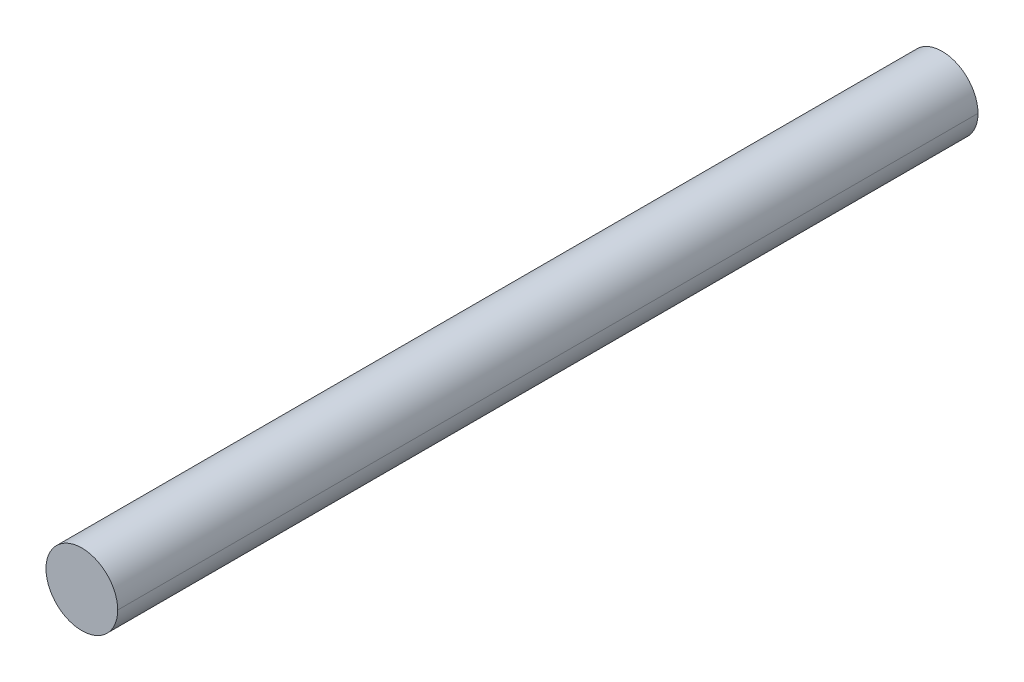
ISO-10303-21;
HEADER;
FILE_DESCRIPTION(('STEP AP214'),'2;1');
FILE_NAME('part.step','',(''),(''),'','','');
FILE_SCHEMA(('AUTOMOTIVE_DESIGN { 1 0 10303 214 1 1 1 1 }'));
ENDSEC;
DATA;
#1=APPLICATION_CONTEXT('core data for automotive mechanical design processes');
#2=APPLICATION_PROTOCOL_DEFINITION('international standard','automotive_design',2000,#1);
#3=PRODUCT_CONTEXT('',#1,'mechanical');
#4=PRODUCT('Part','Part','',(#3));
#5=PRODUCT_RELATED_PRODUCT_CATEGORY('part','',(#4));
#6=PRODUCT_DEFINITION_FORMATION('','',#4);
#7=PRODUCT_DEFINITION_CONTEXT('part definition',#1,'design');
#8=PRODUCT_DEFINITION('design','',#6,#7);
#9=PRODUCT_DEFINITION_SHAPE('','',#8);
#10=(LENGTH_UNIT() NAMED_UNIT(*) SI_UNIT(.MILLI.,.METRE.));
#11=(NAMED_UNIT(*) PLANE_ANGLE_UNIT() SI_UNIT($,.RADIAN.));
#12=(NAMED_UNIT(*) SI_UNIT($,.STERADIAN.) SOLID_ANGLE_UNIT());
#13=UNCERTAINTY_MEASURE_WITH_UNIT(LENGTH_MEASURE(1.E-05),#10,'distance_accuracy_value','');
#14=(GEOMETRIC_REPRESENTATION_CONTEXT(3) GLOBAL_UNCERTAINTY_ASSIGNED_CONTEXT((#13)) GLOBAL_UNIT_ASSIGNED_CONTEXT((#10,
#11,#12)) REPRESENTATION_CONTEXT('',''));
#15=CARTESIAN_POINT('',(0.,0.,0.));
#16=DIRECTION('',(0.,0.,1.));
#17=DIRECTION('',(1.,0.,0.));
#18=AXIS2_PLACEMENT_3D('',#15,#16,#17);
#19=CARTESIAN_POINT('',(0.,0.,-600.));
#20=DIRECTION('',(0.,0.,1.));
#21=DIRECTION('',(1.,0.,0.));
#22=AXIS2_PLACEMENT_3D('',#19,#20,#21);
#23=PLANE('',#22);
#24=CARTESIAN_POINT('',(0.,0.,-600.));
#25=DIRECTION('',(0.,0.,1.));
#26=DIRECTION('',(-1.,0.,0.));
#27=AXIS2_PLACEMENT_3D('',#24,#25,#26);
#28=CIRCLE('',#27,25.);
#29=CARTESIAN_POINT('',(-25.,0.,-600.));
#30=VERTEX_POINT('',#29);
#31=CARTESIAN_POINT('',(25.,0.,-600.));
#32=VERTEX_POINT('',#31);
#33=EDGE_CURVE('E11',#30,#32,#28,.T.);
#34=ORIENTED_EDGE('',*,*,#33,.F.);
#35=CARTESIAN_POINT('',(0.,0.,-600.));
#36=DIRECTION('',(0.,0.,1.));
#37=DIRECTION('',(1.,0.,0.));
#38=AXIS2_PLACEMENT_3D('',#35,#36,#37);
#39=CIRCLE('',#38,25.);
#40=EDGE_CURVE('E32',#32,#30,#39,.T.);
#41=ORIENTED_EDGE('',*,*,#40,.F.);
#42=EDGE_LOOP('',(#34,#41));
#43=FACE_BOUND('',#42,.T.);
#44=ADVANCED_FACE('F17',(#43),#23,.F.);
#45=CARTESIAN_POINT('',(0.,0.,0.));
#46=DIRECTION('',(0.,0.,1.));
#47=DIRECTION('',(1.,0.,0.));
#48=AXIS2_PLACEMENT_3D('',#45,#46,#47);
#49=CYLINDRICAL_SURFACE('',#48,25.);
#50=DIRECTION('',(0.,0.,-1.));
#51=VECTOR('',#50,1.);
#52=CARTESIAN_POINT('',(-25.,0.,0.));
#53=LINE('',#52,#51);
#54=CARTESIAN_POINT('',(-25.,0.,0.));
#55=VERTEX_POINT('',#54);
#56=EDGE_CURVE('E50',#55,#30,#53,.T.);
#57=ORIENTED_EDGE('',*,*,#56,.T.);
#58=ORIENTED_EDGE('',*,*,#33,.T.);
#59=DIRECTION('',(0.,0.,-1.));
#60=VECTOR('',#59,1.);
#61=CARTESIAN_POINT('',(25.,0.,0.));
#62=LINE('',#61,#60);
#63=CARTESIAN_POINT('',(25.,0.,0.));
#64=VERTEX_POINT('',#63);
#65=EDGE_CURVE('E24',#64,#32,#62,.T.);
#66=ORIENTED_EDGE('',*,*,#65,.F.);
#67=CARTESIAN_POINT('',(0.,0.,0.));
#68=DIRECTION('',(0.,0.,1.));
#69=DIRECTION('',(-1.,0.,0.));
#70=AXIS2_PLACEMENT_3D('',#67,#68,#69);
#71=CIRCLE('',#70,25.);
#72=EDGE_CURVE('E43',#55,#64,#71,.T.);
#73=ORIENTED_EDGE('',*,*,#72,.F.);
#74=EDGE_LOOP('',(#57,#58,#66,#73));
#75=FACE_BOUND('',#74,.T.);
#76=ADVANCED_FACE('F41',(#75),#49,.T.);
#77=CARTESIAN_POINT('',(0.,0.,0.));
#78=DIRECTION('',(0.,0.,1.));
#79=DIRECTION('',(1.,0.,0.));
#80=AXIS2_PLACEMENT_3D('',#77,#78,#79);
#81=CYLINDRICAL_SURFACE('',#80,25.);
#82=ORIENTED_EDGE('',*,*,#65,.T.);
#83=ORIENTED_EDGE('',*,*,#40,.T.);
#84=ORIENTED_EDGE('',*,*,#56,.F.);
#85=CARTESIAN_POINT('',(0.,0.,0.));
#86=DIRECTION('',(0.,0.,1.));
#87=DIRECTION('',(1.,0.,0.));
#88=AXIS2_PLACEMENT_3D('',#85,#86,#87);
#89=CIRCLE('',#88,25.);
#90=EDGE_CURVE('E48',#64,#55,#89,.T.);
#91=ORIENTED_EDGE('',*,*,#90,.F.);
#92=EDGE_LOOP('',(#82,#83,#84,#91));
#93=FACE_BOUND('',#92,.T.);
#94=ADVANCED_FACE('F49',(#93),#81,.T.);
#95=CARTESIAN_POINT('',(0.,0.,0.));
#96=DIRECTION('',(0.,0.,1.));
#97=DIRECTION('',(1.,0.,0.));
#98=AXIS2_PLACEMENT_3D('',#95,#96,#97);
#99=PLANE('',#98);
#100=ORIENTED_EDGE('',*,*,#72,.T.);
#101=ORIENTED_EDGE('',*,*,#90,.T.);
#102=EDGE_LOOP('',(#100,#101));
#103=FACE_BOUND('',#102,.T.);
#104=ADVANCED_FACE('F53',(#103),#99,.T.);
#105=CLOSED_SHELL('',(#44,#76,#94,#104));
#106=MANIFOLD_SOLID_BREP('B1',#105);
#107=ADVANCED_BREP_SHAPE_REPRESENTATION('',(#18,#106),#14);
#108=SHAPE_DEFINITION_REPRESENTATION(#9,#107);
ENDSEC;
END-ISO-10303-21;
